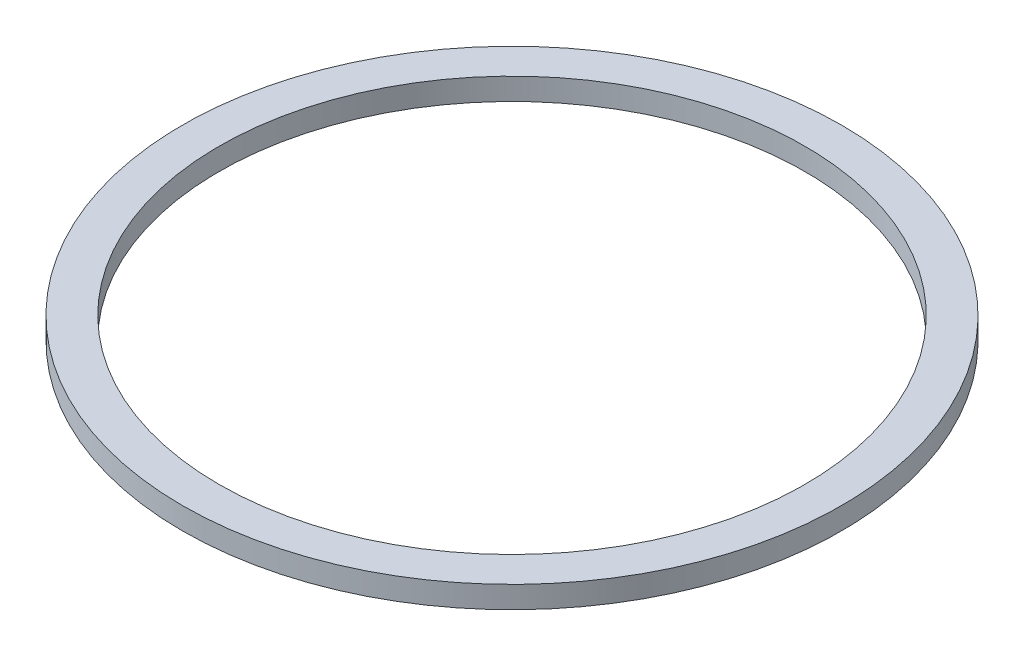
ISO-10303-21;
HEADER;
FILE_DESCRIPTION(('STEP AP214'),'2;1');
FILE_NAME('part.step','',(''),(''),'','','');
FILE_SCHEMA(('AUTOMOTIVE_DESIGN { 1 0 10303 214 1 1 1 1 }'));
ENDSEC;
DATA;
#1=APPLICATION_CONTEXT('core data for automotive mechanical design processes');
#2=APPLICATION_PROTOCOL_DEFINITION('international standard','automotive_design',2000,#1);
#3=PRODUCT_CONTEXT('',#1,'mechanical');
#4=PRODUCT('Part','Part','',(#3));
#5=PRODUCT_RELATED_PRODUCT_CATEGORY('part','',(#4));
#6=PRODUCT_DEFINITION_FORMATION('','',#4);
#7=PRODUCT_DEFINITION_CONTEXT('part definition',#1,'design');
#8=PRODUCT_DEFINITION('design','',#6,#7);
#9=PRODUCT_DEFINITION_SHAPE('','',#8);
#10=(LENGTH_UNIT() NAMED_UNIT(*) SI_UNIT(.MILLI.,.METRE.));
#11=(NAMED_UNIT(*) PLANE_ANGLE_UNIT() SI_UNIT($,.RADIAN.));
#12=(NAMED_UNIT(*) SI_UNIT($,.STERADIAN.) SOLID_ANGLE_UNIT());
#13=UNCERTAINTY_MEASURE_WITH_UNIT(LENGTH_MEASURE(1.E-05),#10,'distance_accuracy_value','');
#14=(GEOMETRIC_REPRESENTATION_CONTEXT(3) GLOBAL_UNCERTAINTY_ASSIGNED_CONTEXT((#13)) GLOBAL_UNIT_ASSIGNED_CONTEXT((#10,
#11,#12)) REPRESENTATION_CONTEXT('',''));
#15=CARTESIAN_POINT('',(0.,0.,0.));
#16=DIRECTION('',(0.,0.,1.));
#17=DIRECTION('',(1.,0.,0.));
#18=AXIS2_PLACEMENT_3D('',#15,#16,#17);
#19=CARTESIAN_POINT('',(0.,2.5,0.));
#20=DIRECTION('',(0.,1.,0.));
#21=DIRECTION('',(0.,0.,1.));
#22=AXIS2_PLACEMENT_3D('',#19,#20,#21);
#23=PLANE('',#22);
#24=CARTESIAN_POINT('',(0.,2.5,0.));
#25=DIRECTION('',(0.,1.,0.));
#26=DIRECTION('',(0.,0.,1.));
#27=AXIS2_PLACEMENT_3D('',#24,#25,#26);
#28=CIRCLE('',#27,37.53);
#29=CARTESIAN_POINT('',(0.,2.5,37.53));
#30=VERTEX_POINT('',#29);
#31=EDGE_CURVE('E11',#30,#30,#28,.T.);
#32=ORIENTED_EDGE('',*,*,#31,.T.);
#33=EDGE_LOOP('',(#32));
#34=FACE_BOUND('',#33,.T.);
#35=CARTESIAN_POINT('',(0.,2.5,0.));
#36=DIRECTION('',(0.,1.,0.));
#37=DIRECTION('',(0.,0.,1.));
#38=AXIS2_PLACEMENT_3D('',#35,#36,#37);
#39=CIRCLE('',#38,33.36);
#40=CARTESIAN_POINT('',(0.,2.5,33.36));
#41=VERTEX_POINT('',#40);
#42=EDGE_CURVE('E56',#41,#41,#39,.T.);
#43=ORIENTED_EDGE('',*,*,#42,.F.);
#44=EDGE_LOOP('',(#43));
#45=FACE_BOUND('',#44,.T.);
#46=ADVANCED_FACE('F43',(#34,#45),#23,.T.);
#47=CARTESIAN_POINT('',(0.,0.,0.));
#48=DIRECTION('',(0.,1.,0.));
#49=DIRECTION('',(0.,0.,1.));
#50=AXIS2_PLACEMENT_3D('',#47,#48,#49);
#51=PLANE('',#50);
#52=CARTESIAN_POINT('',(0.,0.,0.));
#53=DIRECTION('',(0.,1.,0.));
#54=DIRECTION('',(0.,0.,1.));
#55=AXIS2_PLACEMENT_3D('',#52,#53,#54);
#56=CIRCLE('',#55,37.53);
#57=CARTESIAN_POINT('',(0.,0.,37.53));
#58=VERTEX_POINT('',#57);
#59=EDGE_CURVE('E47',#58,#58,#56,.T.);
#60=ORIENTED_EDGE('',*,*,#59,.F.);
#61=EDGE_LOOP('',(#60));
#62=FACE_BOUND('',#61,.T.);
#63=CARTESIAN_POINT('',(0.,0.,0.));
#64=DIRECTION('',(0.,1.,0.));
#65=DIRECTION('',(0.,0.,1.));
#66=AXIS2_PLACEMENT_3D('',#63,#64,#65);
#67=CIRCLE('',#66,33.36);
#68=CARTESIAN_POINT('',(0.,0.,33.36));
#69=VERTEX_POINT('',#68);
#70=EDGE_CURVE('E58',#69,#69,#67,.T.);
#71=ORIENTED_EDGE('',*,*,#70,.T.);
#72=EDGE_LOOP('',(#71));
#73=FACE_BOUND('',#72,.T.);
#74=ADVANCED_FACE('F70',(#62,#73),#51,.F.);
#75=CARTESIAN_POINT('',(0.,2.5,0.));
#76=DIRECTION('',(0.,-1.,0.));
#77=DIRECTION('',(0.,0.,-1.));
#78=AXIS2_PLACEMENT_3D('',#75,#76,#77);
#79=CYLINDRICAL_SURFACE('',#78,37.53);
#80=ORIENTED_EDGE('',*,*,#31,.F.);
#81=EDGE_LOOP('',(#80));
#82=FACE_BOUND('',#81,.T.);
#83=ORIENTED_EDGE('',*,*,#59,.T.);
#84=EDGE_LOOP('',(#83));
#85=FACE_BOUND('',#84,.T.);
#86=ADVANCED_FACE('F45',(#82,#85),#79,.T.);
#87=CARTESIAN_POINT('',(0.,2.5,0.));
#88=DIRECTION('',(0.,-1.,0.));
#89=DIRECTION('',(0.,0.,-1.));
#90=AXIS2_PLACEMENT_3D('',#87,#88,#89);
#91=CYLINDRICAL_SURFACE('',#90,33.36);
#92=ORIENTED_EDGE('',*,*,#42,.T.);
#93=EDGE_LOOP('',(#92));
#94=FACE_BOUND('',#93,.T.);
#95=ORIENTED_EDGE('',*,*,#70,.F.);
#96=EDGE_LOOP('',(#95));
#97=FACE_BOUND('',#96,.T.);
#98=ADVANCED_FACE('F66',(#94,#97),#91,.F.);
#99=CLOSED_SHELL('',(#46,#74,#86,#98));
#100=MANIFOLD_SOLID_BREP('B2',#99);
#101=ADVANCED_BREP_SHAPE_REPRESENTATION('',(#18,#100),#14);
#102=SHAPE_DEFINITION_REPRESENTATION(#9,#101);
ENDSEC;
END-ISO-10303-21;
